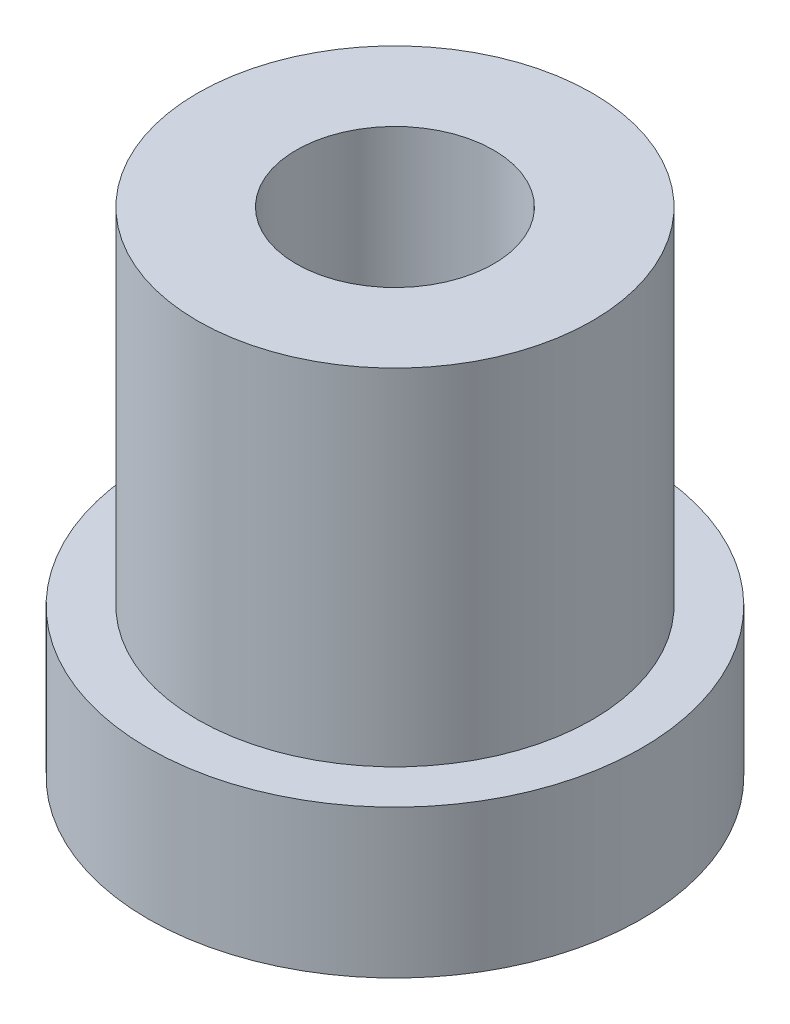
ISO-10303-21;
HEADER;
FILE_DESCRIPTION(('STEP AP214'),'2;1');
FILE_NAME('part.step','',(''),(''),'','','');
FILE_SCHEMA(('AUTOMOTIVE_DESIGN { 1 0 10303 214 1 1 1 1 }'));
ENDSEC;
DATA;
#1=APPLICATION_CONTEXT('core data for automotive mechanical design processes');
#2=APPLICATION_PROTOCOL_DEFINITION('international standard','automotive_design',2000,#1);
#3=PRODUCT_CONTEXT('',#1,'mechanical');
#4=PRODUCT('Part','Part','',(#3));
#5=PRODUCT_RELATED_PRODUCT_CATEGORY('part','',(#4));
#6=PRODUCT_DEFINITION_FORMATION('','',#4);
#7=PRODUCT_DEFINITION_CONTEXT('part definition',#1,'design');
#8=PRODUCT_DEFINITION('design','',#6,#7);
#9=PRODUCT_DEFINITION_SHAPE('','',#8);
#10=(LENGTH_UNIT() NAMED_UNIT(*) SI_UNIT(.MILLI.,.METRE.));
#11=(NAMED_UNIT(*) PLANE_ANGLE_UNIT() SI_UNIT($,.RADIAN.));
#12=(NAMED_UNIT(*) SI_UNIT($,.STERADIAN.) SOLID_ANGLE_UNIT());
#13=UNCERTAINTY_MEASURE_WITH_UNIT(LENGTH_MEASURE(1.E-05),#10,'distance_accuracy_value','');
#14=(GEOMETRIC_REPRESENTATION_CONTEXT(3) GLOBAL_UNCERTAINTY_ASSIGNED_CONTEXT((#13)) GLOBAL_UNIT_ASSIGNED_CONTEXT((#10,
#11,#12)) REPRESENTATION_CONTEXT('',''));
#15=CARTESIAN_POINT('',(0.,0.,0.));
#16=DIRECTION('',(0.,0.,1.));
#17=DIRECTION('',(1.,0.,0.));
#18=AXIS2_PLACEMENT_3D('',#15,#16,#17);
#19=CARTESIAN_POINT('',(0.,20.,0.));
#20=DIRECTION('',(0.,1.,0.));
#21=DIRECTION('',(0.,0.,1.));
#22=AXIS2_PLACEMENT_3D('',#19,#20,#21);
#23=PLANE('',#22);
#24=CARTESIAN_POINT('',(0.,20.,0.));
#25=DIRECTION('',(0.,1.,0.));
#26=DIRECTION('',(0.,0.,1.));
#27=AXIS2_PLACEMENT_3D('',#24,#25,#26);
#28=CIRCLE('',#27,8.);
#29=CARTESIAN_POINT('',(0.,20.,8.));
#30=VERTEX_POINT('',#29);
#31=EDGE_CURVE('E10',#30,#30,#28,.T.);
#32=ORIENTED_EDGE('',*,*,#31,.T.);
#33=EDGE_LOOP('',(#32));
#34=FACE_BOUND('',#33,.T.);
#35=CARTESIAN_POINT('',(0.,20.,0.));
#36=DIRECTION('',(0.,1.,0.));
#37=DIRECTION('',(0.,0.,1.));
#38=AXIS2_PLACEMENT_3D('',#35,#36,#37);
#39=CIRCLE('',#38,4.);
#40=CARTESIAN_POINT('',(0.,20.,4.));
#41=VERTEX_POINT('',#40);
#42=EDGE_CURVE('E46',#41,#41,#39,.T.);
#43=ORIENTED_EDGE('',*,*,#42,.F.);
#44=EDGE_LOOP('',(#43));
#45=FACE_BOUND('',#44,.T.);
#46=ADVANCED_FACE('F30',(#34,#45),#23,.T.);
#47=CARTESIAN_POINT('',(0.,0.,0.));
#48=DIRECTION('',(0.,1.,0.));
#49=DIRECTION('',(0.,0.,1.));
#50=AXIS2_PLACEMENT_3D('',#47,#48,#49);
#51=PLANE('',#50);
#52=CARTESIAN_POINT('',(0.,0.,0.));
#53=DIRECTION('',(0.,1.,0.));
#54=DIRECTION('',(0.,0.,1.));
#55=AXIS2_PLACEMENT_3D('',#52,#53,#54);
#56=CIRCLE('',#55,10.);
#57=CARTESIAN_POINT('',(0.,0.,10.));
#58=VERTEX_POINT('',#57);
#59=EDGE_CURVE('E43',#58,#58,#56,.T.);
#60=ORIENTED_EDGE('',*,*,#59,.F.);
#61=EDGE_LOOP('',(#60));
#62=FACE_BOUND('',#61,.T.);
#63=CARTESIAN_POINT('',(0.,0.,0.));
#64=DIRECTION('',(0.,1.,0.));
#65=DIRECTION('',(0.,0.,1.));
#66=AXIS2_PLACEMENT_3D('',#63,#64,#65);
#67=CIRCLE('',#66,4.);
#68=CARTESIAN_POINT('',(0.,0.,4.));
#69=VERTEX_POINT('',#68);
#70=EDGE_CURVE('E49',#69,#69,#67,.T.);
#71=ORIENTED_EDGE('',*,*,#70,.T.);
#72=EDGE_LOOP('',(#71));
#73=FACE_BOUND('',#72,.T.);
#74=ADVANCED_FACE('F59',(#62,#73),#51,.F.);
#75=CARTESIAN_POINT('',(0.,20.,0.));
#76=DIRECTION('',(0.,-1.,0.));
#77=DIRECTION('',(0.,0.,-1.));
#78=AXIS2_PLACEMENT_3D('',#75,#76,#77);
#79=CYLINDRICAL_SURFACE('',#78,8.);
#80=CARTESIAN_POINT('',(0.,6.00000000000001,0.));
#81=DIRECTION('',(0.,1.,0.));
#82=DIRECTION('',(0.,0.,1.));
#83=AXIS2_PLACEMENT_3D('',#80,#81,#82);
#84=CIRCLE('',#83,8.);
#85=CARTESIAN_POINT('',(0.,6.00000000000001,8.));
#86=VERTEX_POINT('',#85);
#87=EDGE_CURVE('E34',#86,#86,#84,.T.);
#88=ORIENTED_EDGE('',*,*,#87,.T.);
#89=EDGE_LOOP('',(#88));
#90=FACE_BOUND('',#89,.T.);
#91=ORIENTED_EDGE('',*,*,#31,.F.);
#92=EDGE_LOOP('',(#91));
#93=FACE_BOUND('',#92,.T.);
#94=ADVANCED_FACE('F32',(#90,#93),#79,.T.);
#95=CARTESIAN_POINT('',(0.,6.00000000000001,0.));
#96=DIRECTION('',(0.,1.,0.));
#97=DIRECTION('',(0.,0.,1.));
#98=AXIS2_PLACEMENT_3D('',#95,#96,#97);
#99=PLANE('',#98);
#100=CARTESIAN_POINT('',(0.,6.00000000000001,0.));
#101=DIRECTION('',(0.,1.,0.));
#102=DIRECTION('',(0.,0.,1.));
#103=AXIS2_PLACEMENT_3D('',#100,#101,#102);
#104=CIRCLE('',#103,10.);
#105=CARTESIAN_POINT('',(0.,6.00000000000001,10.));
#106=VERTEX_POINT('',#105);
#107=EDGE_CURVE('E41',#106,#106,#104,.T.);
#108=ORIENTED_EDGE('',*,*,#107,.T.);
#109=EDGE_LOOP('',(#108));
#110=FACE_BOUND('',#109,.T.);
#111=ORIENTED_EDGE('',*,*,#87,.F.);
#112=EDGE_LOOP('',(#111));
#113=FACE_BOUND('',#112,.T.);
#114=ADVANCED_FACE('F69',(#110,#113),#99,.T.);
#115=CARTESIAN_POINT('',(0.,6.00000000000001,0.));
#116=DIRECTION('',(0.,-1.,0.));
#117=DIRECTION('',(0.,0.,-1.));
#118=AXIS2_PLACEMENT_3D('',#115,#116,#117);
#119=CYLINDRICAL_SURFACE('',#118,10.);
#120=ORIENTED_EDGE('',*,*,#107,.F.);
#121=EDGE_LOOP('',(#120));
#122=FACE_BOUND('',#121,.T.);
#123=ORIENTED_EDGE('',*,*,#59,.T.);
#124=EDGE_LOOP('',(#123));
#125=FACE_BOUND('',#124,.T.);
#126=ADVANCED_FACE('F66',(#122,#125),#119,.T.);
#127=CARTESIAN_POINT('',(0.,20.,0.));
#128=DIRECTION('',(0.,-1.,0.));
#129=DIRECTION('',(0.,0.,-1.));
#130=AXIS2_PLACEMENT_3D('',#127,#128,#129);
#131=CYLINDRICAL_SURFACE('',#130,4.);
#132=ORIENTED_EDGE('',*,*,#42,.T.);
#133=EDGE_LOOP('',(#132));
#134=FACE_BOUND('',#133,.T.);
#135=ORIENTED_EDGE('',*,*,#70,.F.);
#136=EDGE_LOOP('',(#135));
#137=FACE_BOUND('',#136,.T.);
#138=ADVANCED_FACE('F55',(#134,#137),#131,.F.);
#139=CLOSED_SHELL('',(#46,#74,#94,#114,#126,#138));
#140=MANIFOLD_SOLID_BREP('B2',#139);
#141=ADVANCED_BREP_SHAPE_REPRESENTATION('',(#18,#140),#14);
#142=SHAPE_DEFINITION_REPRESENTATION(#9,#141);
ENDSEC;
END-ISO-10303-21;
